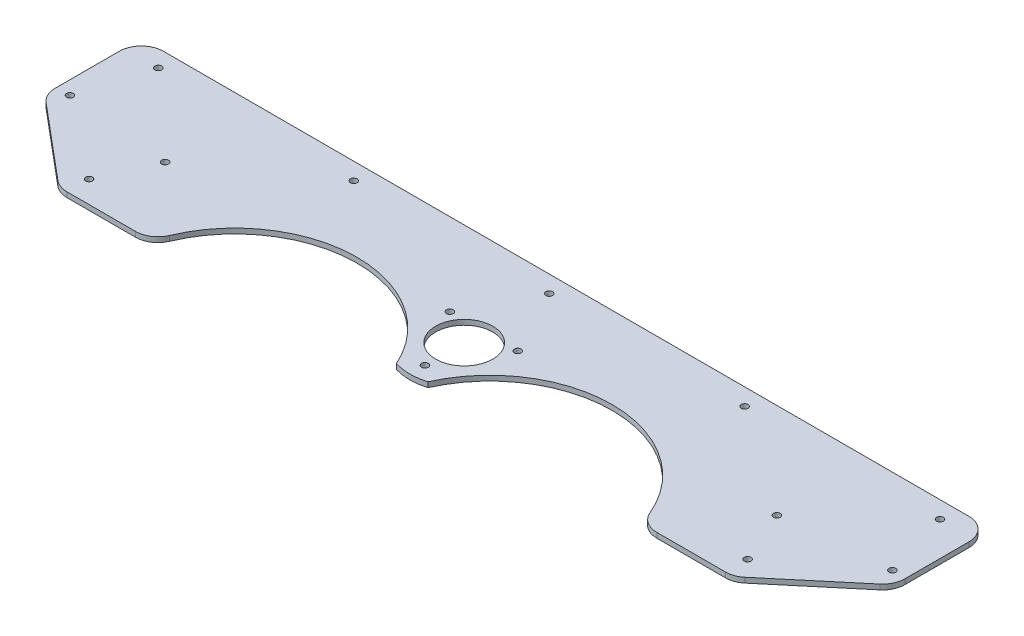
ISO-10303-21;
HEADER;
FILE_DESCRIPTION(('STEP AP214'),'2;1');
FILE_NAME('part.step','',(''),(''),'','','');
FILE_SCHEMA(('AUTOMOTIVE_DESIGN { 1 0 10303 214 1 1 1 1 }'));
ENDSEC;
DATA;
#1=APPLICATION_CONTEXT('core data for automotive mechanical design processes');
#2=APPLICATION_PROTOCOL_DEFINITION('international standard','automotive_design',2000,#1);
#3=PRODUCT_CONTEXT('',#1,'mechanical');
#4=PRODUCT('Part','Part','',(#3));
#5=PRODUCT_RELATED_PRODUCT_CATEGORY('part','',(#4));
#6=PRODUCT_DEFINITION_FORMATION('','',#4);
#7=PRODUCT_DEFINITION_CONTEXT('part definition',#1,'design');
#8=PRODUCT_DEFINITION('design','',#6,#7);
#9=PRODUCT_DEFINITION_SHAPE('','',#8);
#10=(LENGTH_UNIT() NAMED_UNIT(*) SI_UNIT(.MILLI.,.METRE.));
#11=(NAMED_UNIT(*) PLANE_ANGLE_UNIT() SI_UNIT($,.RADIAN.));
#12=(NAMED_UNIT(*) SI_UNIT($,.STERADIAN.) SOLID_ANGLE_UNIT());
#13=UNCERTAINTY_MEASURE_WITH_UNIT(LENGTH_MEASURE(1.E-05),#10,'distance_accuracy_value','');
#14=(GEOMETRIC_REPRESENTATION_CONTEXT(3) GLOBAL_UNCERTAINTY_ASSIGNED_CONTEXT((#13)) GLOBAL_UNIT_ASSIGNED_CONTEXT((#10,
#11,#12)) REPRESENTATION_CONTEXT('',''));
#15=CARTESIAN_POINT('',(0.,0.,0.));
#16=DIRECTION('',(0.,0.,1.));
#17=DIRECTION('',(1.,0.,0.));
#18=AXIS2_PLACEMENT_3D('',#15,#16,#17);
#19=CARTESIAN_POINT('',(0.,1.5,0.));
#20=DIRECTION('',(0.,1.,0.));
#21=DIRECTION('',(0.,0.,1.));
#22=AXIS2_PLACEMENT_3D('',#19,#20,#21);
#23=PLANE('',#22);
#24=CARTESIAN_POINT('',(-121.,1.5,25.));
#25=DIRECTION('',(0.,-1.,0.));
#26=DIRECTION('',(0.,0.,1.));
#27=AXIS2_PLACEMENT_3D('',#24,#25,#26);
#28=CIRCLE('',#27,0.999999999999998);
#29=CARTESIAN_POINT('',(-121.,1.5,26.));
#30=VERTEX_POINT('',#29);
#31=EDGE_CURVE('E379',#30,#30,#28,.T.);
#32=ORIENTED_EDGE('',*,*,#31,.T.);
#33=EDGE_LOOP('',(#32));
#34=FACE_BOUND('',#33,.T.);
#35=CARTESIAN_POINT('',(-90.,1.5,28.));
#36=DIRECTION('',(0.,-1.,0.));
#37=DIRECTION('',(0.,0.,1.));
#38=AXIS2_PLACEMENT_3D('',#35,#36,#37);
#39=CIRCLE('',#38,0.999999999999998);
#40=CARTESIAN_POINT('',(-90.,1.5,29.));
#41=VERTEX_POINT('',#40);
#42=EDGE_CURVE('E386',#41,#41,#39,.T.);
#43=ORIENTED_EDGE('',*,*,#42,.T.);
#44=EDGE_LOOP('',(#43));
#45=FACE_BOUND('',#44,.T.);
#46=CARTESIAN_POINT('',(-96.8841934772697,1.5,43.5));
#47=DIRECTION('',(0.,-1.,0.));
#48=DIRECTION('',(0.,0.,1.));
#49=AXIS2_PLACEMENT_3D('',#46,#47,#48);
#50=CIRCLE('',#49,0.999999999999998);
#51=CARTESIAN_POINT('',(-96.8841934772697,1.5,44.5));
#52=VERTEX_POINT('',#51);
#53=EDGE_CURVE('E392',#52,#52,#50,.T.);
#54=ORIENTED_EDGE('',*,*,#53,.T.);
#55=EDGE_LOOP('',(#54));
#56=FACE_BOUND('',#55,.T.);
#57=CARTESIAN_POINT('',(-115.,1.5,5.));
#58=DIRECTION('',(0.,-1.,0.));
#59=DIRECTION('',(0.,0.,1.));
#60=AXIS2_PLACEMENT_3D('',#57,#58,#59);
#61=CIRCLE('',#60,0.999999999999998);
#62=CARTESIAN_POINT('',(-115.,1.5,6.));
#63=VERTEX_POINT('',#62);
#64=EDGE_CURVE('E398',#63,#63,#61,.T.);
#65=ORIENTED_EDGE('',*,*,#64,.T.);
#66=EDGE_LOOP('',(#65));
#67=FACE_BOUND('',#66,.T.);
#68=CARTESIAN_POINT('',(-57.5,1.5,5.));
#69=DIRECTION('',(0.,-1.,0.));
#70=DIRECTION('',(0.,0.,1.));
#71=AXIS2_PLACEMENT_3D('',#68,#69,#70);
#72=CIRCLE('',#71,0.999999999999998);
#73=CARTESIAN_POINT('',(-57.5,1.5,6.));
#74=VERTEX_POINT('',#73);
#75=EDGE_CURVE('E374',#74,#74,#72,.T.);
#76=ORIENTED_EDGE('',*,*,#75,.T.);
#77=EDGE_LOOP('',(#76));
#78=FACE_BOUND('',#77,.T.);
#79=CARTESIAN_POINT('',(121.,1.5,25.));
#80=DIRECTION('',(0.,1.,0.));
#81=DIRECTION('',(0.,0.,1.));
#82=AXIS2_PLACEMENT_3D('',#79,#80,#81);
#83=CIRCLE('',#82,0.999999999999998);
#84=CARTESIAN_POINT('',(121.,1.5,26.));
#85=VERTEX_POINT('',#84);
#86=EDGE_CURVE('E183',#85,#85,#83,.T.);
#87=ORIENTED_EDGE('',*,*,#86,.F.);
#88=EDGE_LOOP('',(#87));
#89=FACE_BOUND('',#88,.T.);
#90=CARTESIAN_POINT('',(90.,1.5,28.));
#91=DIRECTION('',(0.,1.,0.));
#92=DIRECTION('',(0.,0.,1.));
#93=AXIS2_PLACEMENT_3D('',#90,#91,#92);
#94=CIRCLE('',#93,0.999999999999998);
#95=CARTESIAN_POINT('',(90.,1.5,29.));
#96=VERTEX_POINT('',#95);
#97=EDGE_CURVE('E217',#96,#96,#94,.T.);
#98=ORIENTED_EDGE('',*,*,#97,.F.);
#99=EDGE_LOOP('',(#98));
#100=FACE_BOUND('',#99,.T.);
#101=CARTESIAN_POINT('',(96.8841934772697,1.5,43.5));
#102=DIRECTION('',(0.,1.,0.));
#103=DIRECTION('',(0.,0.,1.));
#104=AXIS2_PLACEMENT_3D('',#101,#102,#103);
#105=CIRCLE('',#104,0.999999999999998);
#106=CARTESIAN_POINT('',(96.8841934772697,1.5,44.5));
#107=VERTEX_POINT('',#106);
#108=EDGE_CURVE('E211',#107,#107,#105,.T.);
#109=ORIENTED_EDGE('',*,*,#108,.F.);
#110=EDGE_LOOP('',(#109));
#111=FACE_BOUND('',#110,.T.);
#112=CARTESIAN_POINT('',(115.,1.5,5.));
#113=DIRECTION('',(0.,1.,0.));
#114=DIRECTION('',(0.,0.,1.));
#115=AXIS2_PLACEMENT_3D('',#112,#113,#114);
#116=CIRCLE('',#115,0.999999999999998);
#117=CARTESIAN_POINT('',(115.,1.5,6.));
#118=VERTEX_POINT('',#117);
#119=EDGE_CURVE('E205',#118,#118,#116,.T.);
#120=ORIENTED_EDGE('',*,*,#119,.F.);
#121=EDGE_LOOP('',(#120));
#122=FACE_BOUND('',#121,.T.);
#123=CARTESIAN_POINT('',(57.5,1.5,5.));
#124=DIRECTION('',(0.,1.,0.));
#125=DIRECTION('',(0.,0.,1.));
#126=AXIS2_PLACEMENT_3D('',#123,#124,#125);
#127=CIRCLE('',#126,0.999999999999998);
#128=CARTESIAN_POINT('',(57.5,1.5,6.));
#129=VERTEX_POINT('',#128);
#130=EDGE_CURVE('E199',#129,#129,#127,.T.);
#131=ORIENTED_EDGE('',*,*,#130,.F.);
#132=EDGE_LOOP('',(#131));
#133=FACE_BOUND('',#132,.T.);
#134=CARTESIAN_POINT('',(0.,1.5,5.));
#135=DIRECTION('',(0.,1.,0.));
#136=DIRECTION('',(0.,0.,1.));
#137=AXIS2_PLACEMENT_3D('',#134,#135,#136);
#138=CIRCLE('',#137,1.);
#139=CARTESIAN_POINT('',(0.,1.5,6.));
#140=VERTEX_POINT('',#139);
#141=EDGE_CURVE('E193',#140,#140,#138,.T.);
#142=ORIENTED_EDGE('',*,*,#141,.F.);
#143=EDGE_LOOP('',(#142));
#144=FACE_BOUND('',#143,.T.);
#145=CARTESIAN_POINT('',(0.,1.5,30.));
#146=DIRECTION('',(0.,1.,0.));
#147=DIRECTION('',(0.,0.,1.));
#148=AXIS2_PLACEMENT_3D('',#145,#146,#147);
#149=CIRCLE('',#148,8.4);
#150=CARTESIAN_POINT('',(0.,1.5,38.4));
#151=VERTEX_POINT('',#150);
#152=EDGE_CURVE('E410',#151,#151,#149,.T.);
#153=ORIENTED_EDGE('',*,*,#152,.F.);
#154=EDGE_LOOP('',(#153));
#155=FACE_BOUND('',#154,.T.);
#156=CARTESIAN_POINT('',(0.,1.5,41.5470053837925));
#157=DIRECTION('',(0.,1.,0.));
#158=DIRECTION('',(0.,0.,1.));
#159=AXIS2_PLACEMENT_3D('',#156,#157,#158);
#160=CIRCLE('',#159,0.999999999999981);
#161=CARTESIAN_POINT('',(0.,1.5,42.5470053837925));
#162=VERTEX_POINT('',#161);
#163=EDGE_CURVE('E427',#162,#162,#160,.T.);
#164=ORIENTED_EDGE('',*,*,#163,.F.);
#165=EDGE_LOOP('',(#164));
#166=FACE_BOUND('',#165,.T.);
#167=CARTESIAN_POINT('',(-10.,1.5,24.2264973081037));
#168=DIRECTION('',(0.,1.,0.));
#169=DIRECTION('',(0.,0.,1.));
#170=AXIS2_PLACEMENT_3D('',#167,#168,#169);
#171=CIRCLE('',#170,1.);
#172=CARTESIAN_POINT('',(-10.,1.5,25.2264973081038));
#173=VERTEX_POINT('',#172);
#174=EDGE_CURVE('E421',#173,#173,#171,.T.);
#175=ORIENTED_EDGE('',*,*,#174,.F.);
#176=EDGE_LOOP('',(#175));
#177=FACE_BOUND('',#176,.T.);
#178=CARTESIAN_POINT('',(10.,1.5,24.2264973081037));
#179=DIRECTION('',(0.,1.,0.));
#180=DIRECTION('',(0.,0.,1.));
#181=AXIS2_PLACEMENT_3D('',#178,#179,#180);
#182=CIRCLE('',#181,1.);
#183=CARTESIAN_POINT('',(10.,1.5,25.2264973081038));
#184=VERTEX_POINT('',#183);
#185=EDGE_CURVE('E167',#184,#184,#182,.T.);
#186=ORIENTED_EDGE('',*,*,#185,.F.);
#187=EDGE_LOOP('',(#186));
#188=FACE_BOUND('',#187,.T.);
#189=CARTESIAN_POINT('',(0.,1.5,30.));
#190=DIRECTION('',(0.,-1.,0.));
#191=DIRECTION('',(0.,0.,1.));
#192=AXIS2_PLACEMENT_3D('',#189,#190,#191);
#193=CIRCLE('',#192,16.);
#194=CARTESIAN_POINT('',(4.63128073876891,1.5,45.3150657432056));
#195=VERTEX_POINT('',#194);
#196=CARTESIAN_POINT('',(-4.6312807387689,1.5,45.3150657432056));
#197=VERTEX_POINT('',#196);
#198=EDGE_CURVE('E50',#195,#197,#193,.T.);
#199=ORIENTED_EDGE('',*,*,#198,.F.);
#200=CARTESIAN_POINT('',(37.5,1.5,60.));
#201=DIRECTION('',(0.,1.,0.));
#202=DIRECTION('',(0.,0.,1.));
#203=AXIS2_PLACEMENT_3D('',#200,#201,#202);
#204=CIRCLE('',#203,36.);
#205=CARTESIAN_POINT('',(70.6761702114062,1.5,46.0235294117647));
#206=VERTEX_POINT('',#205);
#207=EDGE_CURVE('E171',#206,#195,#204,.T.);
#208=ORIENTED_EDGE('',*,*,#207,.F.);
#209=CARTESIAN_POINT('',(76.6663120551323,1.5,43.5));
#210=DIRECTION('',(0.,1.,0.));
#211=DIRECTION('',(0.,0.,1.));
#212=AXIS2_PLACEMENT_3D('',#209,#210,#211);
#213=CIRCLE('',#212,6.5);
#214=CARTESIAN_POINT('',(76.6663120551323,1.5,50.));
#215=VERTEX_POINT('',#214);
#216=EDGE_CURVE('E265',#206,#215,#213,.T.);
#217=ORIENTED_EDGE('',*,*,#216,.T.);
#218=DIRECTION('',(1.,0.,0.));
#219=VECTOR('',#218,1.);
#220=CARTESIAN_POINT('',(0.,1.5,50.));
#221=LINE('',#220,#219);
#222=CARTESIAN_POINT('',(96.8841934772697,1.5,50.));
#223=VERTEX_POINT('',#222);
#224=EDGE_CURVE('E232',#215,#223,#221,.T.);
#225=ORIENTED_EDGE('',*,*,#224,.T.);
#226=CARTESIAN_POINT('',(96.8841934772697,1.5,43.5));
#227=DIRECTION('',(0.,1.,0.));
#228=DIRECTION('',(0.,0.,1.));
#229=AXIS2_PLACEMENT_3D('',#226,#227,#228);
#230=CIRCLE('',#229,6.5);
#231=CARTESIAN_POINT('',(101.062312940232,1.5,48.4792888802734));
#232=VERTEX_POINT('',#231);
#233=EDGE_CURVE('E57',#223,#232,#230,.T.);
#234=ORIENTED_EDGE('',*,*,#233,.T.);
#235=DIRECTION('',(-0.766044443118979,0.,0.642787609686538));
#236=VECTOR('',#235,1.);
#237=CARTESIAN_POINT('',(65.6279030085836,1.5,78.2122891849042));
#238=LINE('',#237,#236);
#239=CARTESIAN_POINT('',(122.678119462962,1.5,30.341473599451));
#240=VERTEX_POINT('',#239);
#241=EDGE_CURVE('E234',#240,#232,#238,.T.);
#242=ORIENTED_EDGE('',*,*,#241,.F.);
#243=CARTESIAN_POINT('',(118.5,1.5,25.3621847191776));
#244=DIRECTION('',(0.,1.,0.));
#245=DIRECTION('',(0.,0.,1.));
#246=AXIS2_PLACEMENT_3D('',#243,#244,#245);
#247=CIRCLE('',#246,6.5);
#248=CARTESIAN_POINT('',(125.,1.5,25.3621847191776));
#249=VERTEX_POINT('',#248);
#250=EDGE_CURVE('E262',#240,#249,#247,.T.);
#251=ORIENTED_EDGE('',*,*,#250,.T.);
#252=DIRECTION('',(0.,0.,1.));
#253=VECTOR('',#252,1.);
#254=CARTESIAN_POINT('',(125.,1.5,0.));
#255=LINE('',#254,#253);
#256=CARTESIAN_POINT('',(125.,1.5,6.5));
#257=VERTEX_POINT('',#256);
#258=EDGE_CURVE('E225',#257,#249,#255,.T.);
#259=ORIENTED_EDGE('',*,*,#258,.F.);
#260=CARTESIAN_POINT('',(118.5,1.5,6.5));
#261=DIRECTION('',(0.,1.,0.));
#262=DIRECTION('',(0.,0.,1.));
#263=AXIS2_PLACEMENT_3D('',#260,#261,#262);
#264=CIRCLE('',#263,6.5);
#265=CARTESIAN_POINT('',(118.5,1.5,0.));
#266=VERTEX_POINT('',#265);
#267=EDGE_CURVE('E267',#257,#266,#264,.T.);
#268=ORIENTED_EDGE('',*,*,#267,.T.);
#269=DIRECTION('',(1.,0.,0.));
#270=VECTOR('',#269,1.);
#271=CARTESIAN_POINT('',(0.,1.5,0.));
#272=LINE('',#271,#270);
#273=CARTESIAN_POINT('',(-118.5,1.5,0.));
#274=VERTEX_POINT('',#273);
#275=EDGE_CURVE('E228',#274,#266,#272,.T.);
#276=ORIENTED_EDGE('',*,*,#275,.F.);
#277=CARTESIAN_POINT('',(-118.5,1.5,6.5));
#278=DIRECTION('',(0.,-1.,0.));
#279=DIRECTION('',(0.,0.,1.));
#280=AXIS2_PLACEMENT_3D('',#277,#278,#279);
#281=CIRCLE('',#280,6.5);
#282=CARTESIAN_POINT('',(-125.,1.5,6.5));
#283=VERTEX_POINT('',#282);
#284=EDGE_CURVE('E316',#283,#274,#281,.T.);
#285=ORIENTED_EDGE('',*,*,#284,.F.);
#286=DIRECTION('',(0.,0.,1.));
#287=VECTOR('',#286,1.);
#288=CARTESIAN_POINT('',(-125.,1.5,0.));
#289=LINE('',#288,#287);
#290=CARTESIAN_POINT('',(-125.,1.5,25.3621847191776));
#291=VERTEX_POINT('',#290);
#292=EDGE_CURVE('E364',#283,#291,#289,.T.);
#293=ORIENTED_EDGE('',*,*,#292,.T.);
#294=CARTESIAN_POINT('',(-118.5,1.5,25.3621847191776));
#295=DIRECTION('',(0.,-1.,0.));
#296=DIRECTION('',(0.,0.,1.));
#297=AXIS2_PLACEMENT_3D('',#294,#295,#296);
#298=CIRCLE('',#297,6.5);
#299=CARTESIAN_POINT('',(-122.678119462962,1.5,30.341473599451));
#300=VERTEX_POINT('',#299);
#301=EDGE_CURVE('E336',#300,#291,#298,.T.);
#302=ORIENTED_EDGE('',*,*,#301,.F.);
#303=DIRECTION('',(0.766044443118979,0.,0.642787609686538));
#304=VECTOR('',#303,1.);
#305=CARTESIAN_POINT('',(-65.6279030085836,1.5,78.2122891849042));
#306=LINE('',#305,#304);
#307=CARTESIAN_POINT('',(-101.062312940232,1.5,48.4792888802734));
#308=VERTEX_POINT('',#307);
#309=EDGE_CURVE('E318',#300,#308,#306,.T.);
#310=ORIENTED_EDGE('',*,*,#309,.T.);
#311=CARTESIAN_POINT('',(-96.8841934772697,1.5,43.5));
#312=DIRECTION('',(0.,-1.,0.));
#313=DIRECTION('',(0.,0.,1.));
#314=AXIS2_PLACEMENT_3D('',#311,#312,#313);
#315=CIRCLE('',#314,6.5);
#316=CARTESIAN_POINT('',(-96.8841934772697,1.5,50.));
#317=VERTEX_POINT('',#316);
#318=EDGE_CURVE('E338',#317,#308,#315,.T.);
#319=ORIENTED_EDGE('',*,*,#318,.F.);
#320=DIRECTION('',(-1.,0.,0.));
#321=VECTOR('',#320,1.);
#322=CARTESIAN_POINT('',(0.,1.5,50.));
#323=LINE('',#322,#321);
#324=CARTESIAN_POINT('',(-76.6663120551323,1.5,50.));
#325=VERTEX_POINT('',#324);
#326=EDGE_CURVE('E323',#325,#317,#323,.T.);
#327=ORIENTED_EDGE('',*,*,#326,.F.);
#328=CARTESIAN_POINT('',(-76.6663120551323,1.5,43.5));
#329=DIRECTION('',(0.,-1.,0.));
#330=DIRECTION('',(0.,0.,1.));
#331=AXIS2_PLACEMENT_3D('',#328,#329,#330);
#332=CIRCLE('',#331,6.5);
#333=CARTESIAN_POINT('',(-70.6761702114062,1.5,46.0235294117647));
#334=VERTEX_POINT('',#333);
#335=EDGE_CURVE('E340',#334,#325,#332,.T.);
#336=ORIENTED_EDGE('',*,*,#335,.F.);
#337=CARTESIAN_POINT('',(-37.5,1.5,60.));
#338=DIRECTION('',(0.,-1.,0.));
#339=DIRECTION('',(0.,0.,1.));
#340=AXIS2_PLACEMENT_3D('',#337,#338,#339);
#341=CIRCLE('',#340,36.);
#342=EDGE_CURVE('E175',#334,#197,#341,.T.);
#343=ORIENTED_EDGE('',*,*,#342,.T.);
#344=EDGE_LOOP('',(#199,#208,#217,#225,#234,#242,#251,#259,#268,#276,#285,#293,#302,#310,#319,
#327,#336,#343));
#345=FACE_BOUND('',#344,.T.);
#346=ADVANCED_FACE('F35',(#34,#45,#56,#67,#78,#89,#100,#111,#122,#133,#144,#155,#166,#177,#188,
#345),#23,.T.);
#347=CARTESIAN_POINT('',(0.,0.,0.));
#348=DIRECTION('',(0.,1.,0.));
#349=DIRECTION('',(0.,0.,1.));
#350=AXIS2_PLACEMENT_3D('',#347,#348,#349);
#351=PLANE('',#350);
#352=CARTESIAN_POINT('',(10.,0.,24.2264973081037));
#353=DIRECTION('',(0.,1.,0.));
#354=DIRECTION('',(0.,0.,1.));
#355=AXIS2_PLACEMENT_3D('',#352,#353,#354);
#356=CIRCLE('',#355,1.);
#357=CARTESIAN_POINT('',(10.,0.,25.2264973081038));
#358=VERTEX_POINT('',#357);
#359=EDGE_CURVE('E418',#358,#358,#356,.T.);
#360=ORIENTED_EDGE('',*,*,#359,.T.);
#361=EDGE_LOOP('',(#360));
#362=FACE_BOUND('',#361,.T.);
#363=CARTESIAN_POINT('',(-10.,0.,24.2264973081037));
#364=DIRECTION('',(0.,1.,0.));
#365=DIRECTION('',(0.,0.,1.));
#366=AXIS2_PLACEMENT_3D('',#363,#364,#365);
#367=CIRCLE('',#366,1.);
#368=CARTESIAN_POINT('',(-10.,0.,25.2264973081038));
#369=VERTEX_POINT('',#368);
#370=EDGE_CURVE('E424',#369,#369,#367,.T.);
#371=ORIENTED_EDGE('',*,*,#370,.T.);
#372=EDGE_LOOP('',(#371));
#373=FACE_BOUND('',#372,.T.);
#374=CARTESIAN_POINT('',(0.,0.,41.5470053837925));
#375=DIRECTION('',(0.,1.,0.));
#376=DIRECTION('',(0.,0.,1.));
#377=AXIS2_PLACEMENT_3D('',#374,#375,#376);
#378=CIRCLE('',#377,0.999999999999981);
#379=CARTESIAN_POINT('',(0.,0.,42.5470053837925));
#380=VERTEX_POINT('',#379);
#381=EDGE_CURVE('E413',#380,#380,#378,.T.);
#382=ORIENTED_EDGE('',*,*,#381,.T.);
#383=EDGE_LOOP('',(#382));
#384=FACE_BOUND('',#383,.T.);
#385=CARTESIAN_POINT('',(0.,0.,30.));
#386=DIRECTION('',(0.,1.,0.));
#387=DIRECTION('',(0.,0.,1.));
#388=AXIS2_PLACEMENT_3D('',#385,#386,#387);
#389=CIRCLE('',#388,8.4);
#390=CARTESIAN_POINT('',(0.,0.,38.4));
#391=VERTEX_POINT('',#390);
#392=EDGE_CURVE('E407',#391,#391,#389,.T.);
#393=ORIENTED_EDGE('',*,*,#392,.T.);
#394=EDGE_LOOP('',(#393));
#395=FACE_BOUND('',#394,.T.);
#396=CARTESIAN_POINT('',(0.,0.,5.));
#397=DIRECTION('',(0.,1.,0.));
#398=DIRECTION('',(0.,0.,1.));
#399=AXIS2_PLACEMENT_3D('',#396,#397,#398);
#400=CIRCLE('',#399,1.);
#401=CARTESIAN_POINT('',(0.,0.,6.));
#402=VERTEX_POINT('',#401);
#403=EDGE_CURVE('E189',#402,#402,#400,.T.);
#404=ORIENTED_EDGE('',*,*,#403,.T.);
#405=EDGE_LOOP('',(#404));
#406=FACE_BOUND('',#405,.T.);
#407=CARTESIAN_POINT('',(57.5,0.,5.));
#408=DIRECTION('',(0.,1.,0.));
#409=DIRECTION('',(0.,0.,1.));
#410=AXIS2_PLACEMENT_3D('',#407,#408,#409);
#411=CIRCLE('',#410,0.999999999999998);
#412=CARTESIAN_POINT('',(57.5,0.,6.));
#413=VERTEX_POINT('',#412);
#414=EDGE_CURVE('E196',#413,#413,#411,.T.);
#415=ORIENTED_EDGE('',*,*,#414,.T.);
#416=EDGE_LOOP('',(#415));
#417=FACE_BOUND('',#416,.T.);
#418=CARTESIAN_POINT('',(115.,0.,5.));
#419=DIRECTION('',(0.,1.,0.));
#420=DIRECTION('',(0.,0.,1.));
#421=AXIS2_PLACEMENT_3D('',#418,#419,#420);
#422=CIRCLE('',#421,0.999999999999998);
#423=CARTESIAN_POINT('',(115.,0.,6.));
#424=VERTEX_POINT('',#423);
#425=EDGE_CURVE('E202',#424,#424,#422,.T.);
#426=ORIENTED_EDGE('',*,*,#425,.T.);
#427=EDGE_LOOP('',(#426));
#428=FACE_BOUND('',#427,.T.);
#429=CARTESIAN_POINT('',(96.8841934772697,0.,43.5));
#430=DIRECTION('',(0.,1.,0.));
#431=DIRECTION('',(0.,0.,1.));
#432=AXIS2_PLACEMENT_3D('',#429,#430,#431);
#433=CIRCLE('',#432,0.999999999999998);
#434=CARTESIAN_POINT('',(96.8841934772697,0.,44.5));
#435=VERTEX_POINT('',#434);
#436=EDGE_CURVE('E208',#435,#435,#433,.T.);
#437=ORIENTED_EDGE('',*,*,#436,.T.);
#438=EDGE_LOOP('',(#437));
#439=FACE_BOUND('',#438,.T.);
#440=CARTESIAN_POINT('',(90.,0.,28.));
#441=DIRECTION('',(0.,1.,0.));
#442=DIRECTION('',(0.,0.,1.));
#443=AXIS2_PLACEMENT_3D('',#440,#441,#442);
#444=CIRCLE('',#443,0.999999999999998);
#445=CARTESIAN_POINT('',(90.,0.,29.));
#446=VERTEX_POINT('',#445);
#447=EDGE_CURVE('E214',#446,#446,#444,.T.);
#448=ORIENTED_EDGE('',*,*,#447,.T.);
#449=EDGE_LOOP('',(#448));
#450=FACE_BOUND('',#449,.T.);
#451=CARTESIAN_POINT('',(121.,0.,25.));
#452=DIRECTION('',(0.,1.,0.));
#453=DIRECTION('',(0.,0.,1.));
#454=AXIS2_PLACEMENT_3D('',#451,#452,#453);
#455=CIRCLE('',#454,0.999999999999998);
#456=CARTESIAN_POINT('',(121.,0.,26.));
#457=VERTEX_POINT('',#456);
#458=EDGE_CURVE('E220',#457,#457,#455,.T.);
#459=ORIENTED_EDGE('',*,*,#458,.T.);
#460=EDGE_LOOP('',(#459));
#461=FACE_BOUND('',#460,.T.);
#462=CARTESIAN_POINT('',(-57.5,0.,5.));
#463=DIRECTION('',(0.,-1.,0.));
#464=DIRECTION('',(0.,0.,1.));
#465=AXIS2_PLACEMENT_3D('',#462,#463,#464);
#466=CIRCLE('',#465,0.999999999999998);
#467=CARTESIAN_POINT('',(-57.5,0.,6.));
#468=VERTEX_POINT('',#467);
#469=EDGE_CURVE('E370',#468,#468,#466,.T.);
#470=ORIENTED_EDGE('',*,*,#469,.F.);
#471=EDGE_LOOP('',(#470));
#472=FACE_BOUND('',#471,.T.);
#473=CARTESIAN_POINT('',(-115.,0.,5.));
#474=DIRECTION('',(0.,-1.,0.));
#475=DIRECTION('',(0.,0.,1.));
#476=AXIS2_PLACEMENT_3D('',#473,#474,#475);
#477=CIRCLE('',#476,0.999999999999998);
#478=CARTESIAN_POINT('',(-115.,0.,6.));
#479=VERTEX_POINT('',#478);
#480=EDGE_CURVE('E401',#479,#479,#477,.T.);
#481=ORIENTED_EDGE('',*,*,#480,.F.);
#482=EDGE_LOOP('',(#481));
#483=FACE_BOUND('',#482,.T.);
#484=CARTESIAN_POINT('',(-96.8841934772697,0.,43.5));
#485=DIRECTION('',(0.,-1.,0.));
#486=DIRECTION('',(0.,0.,1.));
#487=AXIS2_PLACEMENT_3D('',#484,#485,#486);
#488=CIRCLE('',#487,0.999999999999998);
#489=CARTESIAN_POINT('',(-96.8841934772697,0.,44.5));
#490=VERTEX_POINT('',#489);
#491=EDGE_CURVE('E395',#490,#490,#488,.T.);
#492=ORIENTED_EDGE('',*,*,#491,.F.);
#493=EDGE_LOOP('',(#492));
#494=FACE_BOUND('',#493,.T.);
#495=CARTESIAN_POINT('',(-90.,0.,28.));
#496=DIRECTION('',(0.,-1.,0.));
#497=DIRECTION('',(0.,0.,1.));
#498=AXIS2_PLACEMENT_3D('',#495,#496,#497);
#499=CIRCLE('',#498,0.999999999999998);
#500=CARTESIAN_POINT('',(-90.,0.,29.));
#501=VERTEX_POINT('',#500);
#502=EDGE_CURVE('E389',#501,#501,#499,.T.);
#503=ORIENTED_EDGE('',*,*,#502,.F.);
#504=EDGE_LOOP('',(#503));
#505=FACE_BOUND('',#504,.T.);
#506=CARTESIAN_POINT('',(-121.,0.,25.));
#507=DIRECTION('',(0.,-1.,0.));
#508=DIRECTION('',(0.,0.,1.));
#509=AXIS2_PLACEMENT_3D('',#506,#507,#508);
#510=CIRCLE('',#509,0.999999999999998);
#511=CARTESIAN_POINT('',(-121.,0.,26.));
#512=VERTEX_POINT('',#511);
#513=EDGE_CURVE('E382',#512,#512,#510,.T.);
#514=ORIENTED_EDGE('',*,*,#513,.F.);
#515=EDGE_LOOP('',(#514));
#516=FACE_BOUND('',#515,.T.);
#517=CARTESIAN_POINT('',(37.5,0.,60.));
#518=DIRECTION('',(0.,1.,0.));
#519=DIRECTION('',(0.,0.,1.));
#520=AXIS2_PLACEMENT_3D('',#517,#518,#519);
#521=CIRCLE('',#520,36.);
#522=CARTESIAN_POINT('',(70.6761702114062,0.,46.0235294117647));
#523=VERTEX_POINT('',#522);
#524=CARTESIAN_POINT('',(4.63128073876891,0.,45.3150657432056));
#525=VERTEX_POINT('',#524);
#526=EDGE_CURVE('E180',#523,#525,#521,.T.);
#527=ORIENTED_EDGE('',*,*,#526,.T.);
#528=CARTESIAN_POINT('',(0.,0.,30.));
#529=DIRECTION('',(0.,-1.,0.));
#530=DIRECTION('',(0.,0.,1.));
#531=AXIS2_PLACEMENT_3D('',#528,#529,#530);
#532=CIRCLE('',#531,16.);
#533=CARTESIAN_POINT('',(-4.63128073876891,0.,45.3150657432056));
#534=VERTEX_POINT('',#533);
#535=EDGE_CURVE('E162',#525,#534,#532,.T.);
#536=ORIENTED_EDGE('',*,*,#535,.T.);
#537=CARTESIAN_POINT('',(-37.5,0.,60.));
#538=DIRECTION('',(0.,-1.,0.));
#539=DIRECTION('',(0.,0.,1.));
#540=AXIS2_PLACEMENT_3D('',#537,#538,#539);
#541=CIRCLE('',#540,36.);
#542=CARTESIAN_POINT('',(-70.6761702114062,0.,46.0235294117647));
#543=VERTEX_POINT('',#542);
#544=EDGE_CURVE('E383',#543,#534,#541,.T.);
#545=ORIENTED_EDGE('',*,*,#544,.F.);
#546=CARTESIAN_POINT('',(-76.6663120551323,0.,43.5));
#547=DIRECTION('',(0.,-1.,0.));
#548=DIRECTION('',(0.,0.,1.));
#549=AXIS2_PLACEMENT_3D('',#546,#547,#548);
#550=CIRCLE('',#549,6.5);
#551=CARTESIAN_POINT('',(-76.6663120551323,0.,50.));
#552=VERTEX_POINT('',#551);
#553=EDGE_CURVE('E311',#552,#543,#550,.F.);
#554=ORIENTED_EDGE('',*,*,#553,.F.);
#555=DIRECTION('',(-1.,0.,0.));
#556=VECTOR('',#555,1.);
#557=CARTESIAN_POINT('',(0.,0.,50.));
#558=LINE('',#557,#556);
#559=CARTESIAN_POINT('',(-96.8841934772697,0.,50.));
#560=VERTEX_POINT('',#559);
#561=EDGE_CURVE('E369',#552,#560,#558,.T.);
#562=ORIENTED_EDGE('',*,*,#561,.T.);
#563=CARTESIAN_POINT('',(-96.8841934772697,0.,43.5));
#564=DIRECTION('',(0.,-1.,0.));
#565=DIRECTION('',(0.,0.,1.));
#566=AXIS2_PLACEMENT_3D('',#563,#564,#565);
#567=CIRCLE('',#566,6.5);
#568=CARTESIAN_POINT('',(-101.062312940232,0.,48.4792888802734));
#569=VERTEX_POINT('',#568);
#570=EDGE_CURVE('E320',#569,#560,#567,.F.);
#571=ORIENTED_EDGE('',*,*,#570,.F.);
#572=DIRECTION('',(0.766044443118979,0.,0.642787609686538));
#573=VECTOR('',#572,1.);
#574=CARTESIAN_POINT('',(-65.6279030085836,0.,78.2122891849042));
#575=LINE('',#574,#573);
#576=CARTESIAN_POINT('',(-122.678119462962,0.,30.341473599451));
#577=VERTEX_POINT('',#576);
#578=EDGE_CURVE('E326',#577,#569,#575,.T.);
#579=ORIENTED_EDGE('',*,*,#578,.F.);
#580=CARTESIAN_POINT('',(-118.5,0.,25.3621847191776));
#581=DIRECTION('',(0.,-1.,0.));
#582=DIRECTION('',(0.,0.,1.));
#583=AXIS2_PLACEMENT_3D('',#580,#581,#582);
#584=CIRCLE('',#583,6.5);
#585=CARTESIAN_POINT('',(-125.,0.,25.3621847191776));
#586=VERTEX_POINT('',#585);
#587=EDGE_CURVE('E317',#586,#577,#584,.F.);
#588=ORIENTED_EDGE('',*,*,#587,.F.);
#589=DIRECTION('',(0.,0.,1.));
#590=VECTOR('',#589,1.);
#591=CARTESIAN_POINT('',(-125.,0.,0.));
#592=LINE('',#591,#590);
#593=CARTESIAN_POINT('',(-125.,0.,6.5));
#594=VERTEX_POINT('',#593);
#595=EDGE_CURVE('E306',#594,#586,#592,.T.);
#596=ORIENTED_EDGE('',*,*,#595,.F.);
#597=CARTESIAN_POINT('',(-118.5,0.,6.5));
#598=DIRECTION('',(0.,-1.,0.));
#599=DIRECTION('',(0.,0.,1.));
#600=AXIS2_PLACEMENT_3D('',#597,#598,#599);
#601=CIRCLE('',#600,6.5);
#602=CARTESIAN_POINT('',(-118.5,0.,0.));
#603=VERTEX_POINT('',#602);
#604=EDGE_CURVE('E303',#603,#594,#601,.F.);
#605=ORIENTED_EDGE('',*,*,#604,.F.);
#606=DIRECTION('',(1.,0.,0.));
#607=VECTOR('',#606,1.);
#608=CARTESIAN_POINT('',(0.,0.,0.));
#609=LINE('',#608,#607);
#610=CARTESIAN_POINT('',(118.5,0.,0.));
#611=VERTEX_POINT('',#610);
#612=EDGE_CURVE('E239',#603,#611,#609,.T.);
#613=ORIENTED_EDGE('',*,*,#612,.T.);
#614=CARTESIAN_POINT('',(118.5,0.,6.5));
#615=DIRECTION('',(0.,1.,0.));
#616=DIRECTION('',(0.,0.,1.));
#617=AXIS2_PLACEMENT_3D('',#614,#615,#616);
#618=CIRCLE('',#617,6.5);
#619=CARTESIAN_POINT('',(125.,0.,6.5));
#620=VERTEX_POINT('',#619);
#621=EDGE_CURVE('E255',#611,#620,#618,.F.);
#622=ORIENTED_EDGE('',*,*,#621,.T.);
#623=DIRECTION('',(0.,0.,1.));
#624=VECTOR('',#623,1.);
#625=CARTESIAN_POINT('',(125.,0.,0.));
#626=LINE('',#625,#624);
#627=CARTESIAN_POINT('',(125.,0.,25.3621847191776));
#628=VERTEX_POINT('',#627);
#629=EDGE_CURVE('E192',#620,#628,#626,.T.);
#630=ORIENTED_EDGE('',*,*,#629,.T.);
#631=CARTESIAN_POINT('',(118.5,0.,25.3621847191776));
#632=DIRECTION('',(0.,1.,0.));
#633=DIRECTION('',(0.,0.,1.));
#634=AXIS2_PLACEMENT_3D('',#631,#632,#633);
#635=CIRCLE('',#634,6.5);
#636=CARTESIAN_POINT('',(122.678119462962,0.,30.341473599451));
#637=VERTEX_POINT('',#636);
#638=EDGE_CURVE('E249',#628,#637,#635,.F.);
#639=ORIENTED_EDGE('',*,*,#638,.T.);
#640=DIRECTION('',(-0.766044443118979,0.,0.642787609686538));
#641=VECTOR('',#640,1.);
#642=CARTESIAN_POINT('',(65.6279030085836,0.,78.2122891849042));
#643=LINE('',#642,#641);
#644=CARTESIAN_POINT('',(101.062312940232,0.,48.4792888802734));
#645=VERTEX_POINT('',#644);
#646=EDGE_CURVE('E229',#637,#645,#643,.T.);
#647=ORIENTED_EDGE('',*,*,#646,.T.);
#648=CARTESIAN_POINT('',(96.8841934772697,0.,43.5));
#649=DIRECTION('',(0.,1.,0.));
#650=DIRECTION('',(0.,0.,1.));
#651=AXIS2_PLACEMENT_3D('',#648,#649,#650);
#652=CIRCLE('',#651,6.5);
#653=CARTESIAN_POINT('',(96.8841934772697,0.,50.));
#654=VERTEX_POINT('',#653);
#655=EDGE_CURVE('E251',#645,#654,#652,.F.);
#656=ORIENTED_EDGE('',*,*,#655,.T.);
#657=DIRECTION('',(1.,0.,0.));
#658=VECTOR('',#657,1.);
#659=CARTESIAN_POINT('',(0.,0.,50.));
#660=LINE('',#659,#658);
#661=CARTESIAN_POINT('',(76.6663120551323,0.,50.));
#662=VERTEX_POINT('',#661);
#663=EDGE_CURVE('E242',#662,#654,#660,.T.);
#664=ORIENTED_EDGE('',*,*,#663,.F.);
#665=CARTESIAN_POINT('',(76.6663120551323,0.,43.5));
#666=DIRECTION('',(0.,1.,0.));
#667=DIRECTION('',(0.,0.,1.));
#668=AXIS2_PLACEMENT_3D('',#665,#666,#667);
#669=CIRCLE('',#668,6.5);
#670=EDGE_CURVE('E253',#662,#523,#669,.F.);
#671=ORIENTED_EDGE('',*,*,#670,.T.);
#672=EDGE_LOOP('',(#527,#536,#545,#554,#562,#571,#579,#588,#596,#605,#613,#622,#630,#639,#647,
#656,#664,#671));
#673=FACE_BOUND('',#672,.T.);
#674=ADVANCED_FACE('F284',(#362,#373,#384,#395,#406,#417,#428,#439,#450,#461,#472,#483,#494,
#505,#516,#673),#351,.F.);
#675=CARTESIAN_POINT('',(125.,1.5,0.));
#676=DIRECTION('',(1.,0.,0.));
#677=DIRECTION('',(0.,0.,-1.));
#678=AXIS2_PLACEMENT_3D('',#675,#676,#677);
#679=PLANE('',#678);
#680=ORIENTED_EDGE('',*,*,#629,.F.);
#681=DIRECTION('',(0.,-1.,0.));
#682=VECTOR('',#681,1.);
#683=CARTESIAN_POINT('',(125.,1.5,6.5));
#684=LINE('',#683,#682);
#685=EDGE_CURVE('E260',#620,#257,#684,.F.);
#686=ORIENTED_EDGE('',*,*,#685,.T.);
#687=ORIENTED_EDGE('',*,*,#258,.T.);
#688=DIRECTION('',(0.,-1.,0.));
#689=VECTOR('',#688,1.);
#690=CARTESIAN_POINT('',(125.,1.5,25.3621847191776));
#691=LINE('',#690,#689);
#692=EDGE_CURVE('E257',#249,#628,#691,.T.);
#693=ORIENTED_EDGE('',*,*,#692,.T.);
#694=EDGE_LOOP('',(#680,#686,#687,#693));
#695=FACE_BOUND('',#694,.T.);
#696=ADVANCED_FACE('F291',(#695),#679,.T.);
#697=CARTESIAN_POINT('',(0.,1.5,0.));
#698=DIRECTION('',(0.,0.,-1.));
#699=DIRECTION('',(-1.,0.,0.));
#700=AXIS2_PLACEMENT_3D('',#697,#698,#699);
#701=PLANE('',#700);
#702=ORIENTED_EDGE('',*,*,#275,.T.);
#703=DIRECTION('',(0.,-1.,0.));
#704=VECTOR('',#703,1.);
#705=CARTESIAN_POINT('',(118.5,1.5,0.));
#706=LINE('',#705,#704);
#707=EDGE_CURVE('E236',#266,#611,#706,.T.);
#708=ORIENTED_EDGE('',*,*,#707,.T.);
#709=ORIENTED_EDGE('',*,*,#612,.F.);
#710=DIRECTION('',(0.,-1.,0.));
#711=VECTOR('',#710,1.);
#712=CARTESIAN_POINT('',(-118.5,1.5,0.));
#713=LINE('',#712,#711);
#714=EDGE_CURVE('E314',#274,#603,#713,.T.);
#715=ORIENTED_EDGE('',*,*,#714,.F.);
#716=EDGE_LOOP('',(#702,#708,#709,#715));
#717=FACE_BOUND('',#716,.T.);
#718=ADVANCED_FACE('F299',(#717),#701,.T.);
#719=CARTESIAN_POINT('',(0.,1.5,50.));
#720=DIRECTION('',(0.,0.,-1.));
#721=DIRECTION('',(-1.,0.,0.));
#722=AXIS2_PLACEMENT_3D('',#719,#720,#721);
#723=PLANE('',#722);
#724=ORIENTED_EDGE('',*,*,#224,.F.);
#725=DIRECTION('',(0.,1.,0.));
#726=VECTOR('',#725,1.);
#727=CARTESIAN_POINT('',(76.6663120551323,1.5,50.));
#728=LINE('',#727,#726);
#729=EDGE_CURVE('E271',#215,#662,#728,.F.);
#730=ORIENTED_EDGE('',*,*,#729,.T.);
#731=ORIENTED_EDGE('',*,*,#663,.T.);
#732=DIRECTION('',(0.,-1.,0.));
#733=VECTOR('',#732,1.);
#734=CARTESIAN_POINT('',(96.8841934772697,1.5,50.));
#735=LINE('',#734,#733);
#736=EDGE_CURVE('E269',#654,#223,#735,.F.);
#737=ORIENTED_EDGE('',*,*,#736,.T.);
#738=EDGE_LOOP('',(#724,#730,#731,#737));
#739=FACE_BOUND('',#738,.T.);
#740=ADVANCED_FACE('F468',(#739),#723,.F.);
#741=CARTESIAN_POINT('',(65.6279030085836,1.5,78.2122891849042));
#742=DIRECTION('',(0.642787609686538,0.,0.766044443118979));
#743=DIRECTION('',(0.766044443118979,0.,-0.642787609686538));
#744=AXIS2_PLACEMENT_3D('',#741,#742,#743);
#745=PLANE('',#744);
#746=ORIENTED_EDGE('',*,*,#241,.T.);
#747=DIRECTION('',(0.,-1.,0.));
#748=VECTOR('',#747,1.);
#749=CARTESIAN_POINT('',(101.062312940232,0.,48.4792888802734));
#750=LINE('',#749,#748);
#751=EDGE_CURVE('E43',#232,#645,#750,.T.);
#752=ORIENTED_EDGE('',*,*,#751,.T.);
#753=ORIENTED_EDGE('',*,*,#646,.F.);
#754=DIRECTION('',(0.,-1.,0.));
#755=VECTOR('',#754,1.);
#756=CARTESIAN_POINT('',(122.678119462962,1.5,30.341473599451));
#757=LINE('',#756,#755);
#758=EDGE_CURVE('E275',#637,#240,#757,.F.);
#759=ORIENTED_EDGE('',*,*,#758,.T.);
#760=EDGE_LOOP('',(#746,#752,#753,#759));
#761=FACE_BOUND('',#760,.T.);
#762=ADVANCED_FACE('F280',(#761),#745,.T.);
#763=CARTESIAN_POINT('',(121.,0.,25.));
#764=DIRECTION('',(0.,1.,0.));
#765=DIRECTION('',(0.,0.,1.));
#766=AXIS2_PLACEMENT_3D('',#763,#764,#765);
#767=CYLINDRICAL_SURFACE('',#766,0.999999999999998);
#768=ORIENTED_EDGE('',*,*,#458,.F.);
#769=EDGE_LOOP('',(#768));
#770=FACE_BOUND('',#769,.T.);
#771=ORIENTED_EDGE('',*,*,#86,.T.);
#772=EDGE_LOOP('',(#771));
#773=FACE_BOUND('',#772,.T.);
#774=ADVANCED_FACE('F463',(#770,#773),#767,.F.);
#775=CARTESIAN_POINT('',(90.,0.,28.));
#776=DIRECTION('',(0.,1.,0.));
#777=DIRECTION('',(0.,0.,1.));
#778=AXIS2_PLACEMENT_3D('',#775,#776,#777);
#779=CYLINDRICAL_SURFACE('',#778,0.999999999999998);
#780=ORIENTED_EDGE('',*,*,#447,.F.);
#781=EDGE_LOOP('',(#780));
#782=FACE_BOUND('',#781,.T.);
#783=ORIENTED_EDGE('',*,*,#97,.T.);
#784=EDGE_LOOP('',(#783));
#785=FACE_BOUND('',#784,.T.);
#786=ADVANCED_FACE('F711',(#782,#785),#779,.F.);
#787=CARTESIAN_POINT('',(96.8841934772697,0.,43.5));
#788=DIRECTION('',(0.,1.,0.));
#789=DIRECTION('',(0.,0.,1.));
#790=AXIS2_PLACEMENT_3D('',#787,#788,#789);
#791=CYLINDRICAL_SURFACE('',#790,0.999999999999998);
#792=ORIENTED_EDGE('',*,*,#436,.F.);
#793=EDGE_LOOP('',(#792));
#794=FACE_BOUND('',#793,.T.);
#795=ORIENTED_EDGE('',*,*,#108,.T.);
#796=EDGE_LOOP('',(#795));
#797=FACE_BOUND('',#796,.T.);
#798=ADVANCED_FACE('F702',(#794,#797),#791,.F.);
#799=CARTESIAN_POINT('',(115.,0.,5.));
#800=DIRECTION('',(0.,1.,0.));
#801=DIRECTION('',(0.,0.,1.));
#802=AXIS2_PLACEMENT_3D('',#799,#800,#801);
#803=CYLINDRICAL_SURFACE('',#802,0.999999999999998);
#804=ORIENTED_EDGE('',*,*,#425,.F.);
#805=EDGE_LOOP('',(#804));
#806=FACE_BOUND('',#805,.T.);
#807=ORIENTED_EDGE('',*,*,#119,.T.);
#808=EDGE_LOOP('',(#807));
#809=FACE_BOUND('',#808,.T.);
#810=ADVANCED_FACE('F693',(#806,#809),#803,.F.);
#811=CARTESIAN_POINT('',(57.5,0.,5.));
#812=DIRECTION('',(0.,1.,0.));
#813=DIRECTION('',(0.,0.,1.));
#814=AXIS2_PLACEMENT_3D('',#811,#812,#813);
#815=CYLINDRICAL_SURFACE('',#814,0.999999999999998);
#816=ORIENTED_EDGE('',*,*,#414,.F.);
#817=EDGE_LOOP('',(#816));
#818=FACE_BOUND('',#817,.T.);
#819=ORIENTED_EDGE('',*,*,#130,.T.);
#820=EDGE_LOOP('',(#819));
#821=FACE_BOUND('',#820,.T.);
#822=ADVANCED_FACE('F689',(#818,#821),#815,.F.);
#823=CARTESIAN_POINT('',(0.,0.,5.));
#824=DIRECTION('',(0.,1.,0.));
#825=DIRECTION('',(0.,0.,1.));
#826=AXIS2_PLACEMENT_3D('',#823,#824,#825);
#827=CYLINDRICAL_SURFACE('',#826,1.);
#828=ORIENTED_EDGE('',*,*,#141,.T.);
#829=EDGE_LOOP('',(#828));
#830=FACE_BOUND('',#829,.T.);
#831=ORIENTED_EDGE('',*,*,#403,.F.);
#832=EDGE_LOOP('',(#831));
#833=FACE_BOUND('',#832,.T.);
#834=ADVANCED_FACE('F633',(#830,#833),#827,.F.);
#835=CARTESIAN_POINT('',(37.5,0.,60.));
#836=DIRECTION('',(0.,1.,0.));
#837=DIRECTION('',(0.,0.,1.));
#838=AXIS2_PLACEMENT_3D('',#835,#836,#837);
#839=CYLINDRICAL_SURFACE('',#838,36.);
#840=ORIENTED_EDGE('',*,*,#207,.T.);
#841=DIRECTION('',(0.,1.,0.));
#842=VECTOR('',#841,1.);
#843=CARTESIAN_POINT('',(4.6312807387689,0.75,45.3150657432056));
#844=LINE('',#843,#842);
#845=EDGE_CURVE('E159',#195,#525,#844,.F.);
#846=ORIENTED_EDGE('',*,*,#845,.T.);
#847=ORIENTED_EDGE('',*,*,#526,.F.);
#848=DIRECTION('',(0.,1.,0.));
#849=VECTOR('',#848,1.);
#850=CARTESIAN_POINT('',(70.6761702114062,0.,46.0235294117647));
#851=LINE('',#850,#849);
#852=EDGE_CURVE('E179',#523,#206,#851,.T.);
#853=ORIENTED_EDGE('',*,*,#852,.T.);
#854=EDGE_LOOP('',(#840,#846,#847,#853));
#855=FACE_BOUND('',#854,.T.);
#856=ADVANCED_FACE('F177',(#855),#839,.F.);
#857=CARTESIAN_POINT('',(118.5,1.5,6.5));
#858=DIRECTION('',(0.,-1.,0.));
#859=DIRECTION('',(0.,0.,-1.));
#860=AXIS2_PLACEMENT_3D('',#857,#858,#859);
#861=CYLINDRICAL_SURFACE('',#860,6.5);
#862=ORIENTED_EDGE('',*,*,#267,.F.);
#863=ORIENTED_EDGE('',*,*,#685,.F.);
#864=ORIENTED_EDGE('',*,*,#621,.F.);
#865=ORIENTED_EDGE('',*,*,#707,.F.);
#866=EDGE_LOOP('',(#862,#863,#864,#865));
#867=FACE_BOUND('',#866,.T.);
#868=ADVANCED_FACE('F297',(#867),#861,.T.);
#869=CARTESIAN_POINT('',(76.6663120551323,0.,43.5));
#870=DIRECTION('',(0.,1.,0.));
#871=DIRECTION('',(0.,0.,1.));
#872=AXIS2_PLACEMENT_3D('',#869,#870,#871);
#873=CYLINDRICAL_SURFACE('',#872,6.5);
#874=ORIENTED_EDGE('',*,*,#216,.F.);
#875=ORIENTED_EDGE('',*,*,#852,.F.);
#876=ORIENTED_EDGE('',*,*,#670,.F.);
#877=ORIENTED_EDGE('',*,*,#729,.F.);
#878=EDGE_LOOP('',(#874,#875,#876,#877));
#879=FACE_BOUND('',#878,.T.);
#880=ADVANCED_FACE('F478',(#879),#873,.T.);
#881=CARTESIAN_POINT('',(96.8841934772697,1.5,43.5));
#882=DIRECTION('',(0.,1.,0.));
#883=DIRECTION('',(0.,0.,1.));
#884=AXIS2_PLACEMENT_3D('',#881,#882,#883);
#885=CYLINDRICAL_SURFACE('',#884,6.5);
#886=ORIENTED_EDGE('',*,*,#233,.F.);
#887=ORIENTED_EDGE('',*,*,#736,.F.);
#888=ORIENTED_EDGE('',*,*,#655,.F.);
#889=ORIENTED_EDGE('',*,*,#751,.F.);
#890=EDGE_LOOP('',(#886,#887,#888,#889));
#891=FACE_BOUND('',#890,.T.);
#892=ADVANCED_FACE('F480',(#891),#885,.T.);
#893=CARTESIAN_POINT('',(118.5,1.5,25.3621847191776));
#894=DIRECTION('',(0.,-1.,0.));
#895=DIRECTION('',(0.,0.,-1.));
#896=AXIS2_PLACEMENT_3D('',#893,#894,#895);
#897=CYLINDRICAL_SURFACE('',#896,6.5);
#898=ORIENTED_EDGE('',*,*,#250,.F.);
#899=ORIENTED_EDGE('',*,*,#758,.F.);
#900=ORIENTED_EDGE('',*,*,#638,.F.);
#901=ORIENTED_EDGE('',*,*,#692,.F.);
#902=EDGE_LOOP('',(#898,#899,#900,#901));
#903=FACE_BOUND('',#902,.T.);
#904=ADVANCED_FACE('F37',(#903),#897,.T.);
#905=CARTESIAN_POINT('',(-125.,1.5,0.));
#906=DIRECTION('',(-1.,0.,0.));
#907=DIRECTION('',(0.,0.,-1.));
#908=AXIS2_PLACEMENT_3D('',#905,#906,#907);
#909=PLANE('',#908);
#910=ORIENTED_EDGE('',*,*,#595,.T.);
#911=DIRECTION('',(0.,-1.,0.));
#912=VECTOR('',#911,1.);
#913=CARTESIAN_POINT('',(-125.,1.5,25.3621847191776));
#914=LINE('',#913,#912);
#915=EDGE_CURVE('E310',#291,#586,#914,.T.);
#916=ORIENTED_EDGE('',*,*,#915,.F.);
#917=ORIENTED_EDGE('',*,*,#292,.F.);
#918=DIRECTION('',(0.,-1.,0.));
#919=VECTOR('',#918,1.);
#920=CARTESIAN_POINT('',(-125.,1.5,6.5));
#921=LINE('',#920,#919);
#922=EDGE_CURVE('E334',#594,#283,#921,.F.);
#923=ORIENTED_EDGE('',*,*,#922,.F.);
#924=EDGE_LOOP('',(#910,#916,#917,#923));
#925=FACE_BOUND('',#924,.T.);
#926=ADVANCED_FACE('F368',(#925),#909,.T.);
#927=CARTESIAN_POINT('',(0.,1.5,50.));
#928=DIRECTION('',(0.,0.,-1.));
#929=DIRECTION('',(1.,0.,0.));
#930=AXIS2_PLACEMENT_3D('',#927,#928,#929);
#931=PLANE('',#930);
#932=ORIENTED_EDGE('',*,*,#326,.T.);
#933=DIRECTION('',(0.,-1.,0.));
#934=VECTOR('',#933,1.);
#935=CARTESIAN_POINT('',(-96.8841934772697,1.5,50.));
#936=LINE('',#935,#934);
#937=EDGE_CURVE('E343',#560,#317,#936,.F.);
#938=ORIENTED_EDGE('',*,*,#937,.F.);
#939=ORIENTED_EDGE('',*,*,#561,.F.);
#940=DIRECTION('',(0.,1.,0.));
#941=VECTOR('',#940,1.);
#942=CARTESIAN_POINT('',(-76.6663120551323,1.5,50.));
#943=LINE('',#942,#941);
#944=EDGE_CURVE('E346',#325,#552,#943,.F.);
#945=ORIENTED_EDGE('',*,*,#944,.F.);
#946=EDGE_LOOP('',(#932,#938,#939,#945));
#947=FACE_BOUND('',#946,.T.);
#948=ADVANCED_FACE('F441',(#947),#931,.F.);
#949=CARTESIAN_POINT('',(-65.6279030085836,1.5,78.2122891849042));
#950=DIRECTION('',(-0.642787609686538,0.,0.766044443118979));
#951=DIRECTION('',(-0.766044443118979,0.,-0.642787609686538));
#952=AXIS2_PLACEMENT_3D('',#949,#950,#951);
#953=PLANE('',#952);
#954=ORIENTED_EDGE('',*,*,#309,.F.);
#955=DIRECTION('',(0.,-1.,0.));
#956=VECTOR('',#955,1.);
#957=CARTESIAN_POINT('',(-122.678119462962,1.5,30.341473599451));
#958=LINE('',#957,#956);
#959=EDGE_CURVE('E186',#577,#300,#958,.F.);
#960=ORIENTED_EDGE('',*,*,#959,.F.);
#961=ORIENTED_EDGE('',*,*,#578,.T.);
#962=DIRECTION('',(0.,-1.,0.));
#963=VECTOR('',#962,1.);
#964=CARTESIAN_POINT('',(-101.062312940232,0.,48.4792888802734));
#965=LINE('',#964,#963);
#966=EDGE_CURVE('E181',#308,#569,#965,.T.);
#967=ORIENTED_EDGE('',*,*,#966,.F.);
#968=EDGE_LOOP('',(#954,#960,#961,#967));
#969=FACE_BOUND('',#968,.T.);
#970=ADVANCED_FACE('F361',(#969),#953,.T.);
#971=CARTESIAN_POINT('',(-121.,0.,25.));
#972=DIRECTION('',(0.,1.,0.));
#973=DIRECTION('',(0.,0.,1.));
#974=AXIS2_PLACEMENT_3D('',#971,#972,#973);
#975=CYLINDRICAL_SURFACE('',#974,0.999999999999998);
#976=ORIENTED_EDGE('',*,*,#513,.T.);
#977=EDGE_LOOP('',(#976));
#978=FACE_BOUND('',#977,.T.);
#979=ORIENTED_EDGE('',*,*,#31,.F.);
#980=EDGE_LOOP('',(#979));
#981=FACE_BOUND('',#980,.T.);
#982=ADVANCED_FACE('F524',(#978,#981),#975,.F.);
#983=CARTESIAN_POINT('',(-90.,0.,28.));
#984=DIRECTION('',(0.,1.,0.));
#985=DIRECTION('',(0.,0.,1.));
#986=AXIS2_PLACEMENT_3D('',#983,#984,#985);
#987=CYLINDRICAL_SURFACE('',#986,0.999999999999998);
#988=ORIENTED_EDGE('',*,*,#502,.T.);
#989=EDGE_LOOP('',(#988));
#990=FACE_BOUND('',#989,.T.);
#991=ORIENTED_EDGE('',*,*,#42,.F.);
#992=EDGE_LOOP('',(#991));
#993=FACE_BOUND('',#992,.T.);
#994=ADVANCED_FACE('F520',(#990,#993),#987,.F.);
#995=CARTESIAN_POINT('',(-96.8841934772697,0.,43.5));
#996=DIRECTION('',(0.,1.,0.));
#997=DIRECTION('',(0.,0.,1.));
#998=AXIS2_PLACEMENT_3D('',#995,#996,#997);
#999=CYLINDRICAL_SURFACE('',#998,0.999999999999998);
#1000=ORIENTED_EDGE('',*,*,#491,.T.);
#1001=EDGE_LOOP('',(#1000));
#1002=FACE_BOUND('',#1001,.T.);
#1003=ORIENTED_EDGE('',*,*,#53,.F.);
#1004=EDGE_LOOP('',(#1003));
#1005=FACE_BOUND('',#1004,.T.);
#1006=ADVANCED_FACE('F516',(#1002,#1005),#999,.F.);
#1007=CARTESIAN_POINT('',(-115.,0.,5.));
#1008=DIRECTION('',(0.,1.,0.));
#1009=DIRECTION('',(0.,0.,1.));
#1010=AXIS2_PLACEMENT_3D('',#1007,#1008,#1009);
#1011=CYLINDRICAL_SURFACE('',#1010,0.999999999999998);
#1012=ORIENTED_EDGE('',*,*,#480,.T.);
#1013=EDGE_LOOP('',(#1012));
#1014=FACE_BOUND('',#1013,.T.);
#1015=ORIENTED_EDGE('',*,*,#64,.F.);
#1016=EDGE_LOOP('',(#1015));
#1017=FACE_BOUND('',#1016,.T.);
#1018=ADVANCED_FACE('F508',(#1014,#1017),#1011,.F.);
#1019=CARTESIAN_POINT('',(-57.5,0.,5.));
#1020=DIRECTION('',(0.,1.,0.));
#1021=DIRECTION('',(0.,0.,1.));
#1022=AXIS2_PLACEMENT_3D('',#1019,#1020,#1021);
#1023=CYLINDRICAL_SURFACE('',#1022,0.999999999999998);
#1024=ORIENTED_EDGE('',*,*,#469,.T.);
#1025=EDGE_LOOP('',(#1024));
#1026=FACE_BOUND('',#1025,.T.);
#1027=ORIENTED_EDGE('',*,*,#75,.F.);
#1028=EDGE_LOOP('',(#1027));
#1029=FACE_BOUND('',#1028,.T.);
#1030=ADVANCED_FACE('F503',(#1026,#1029),#1023,.F.);
#1031=CARTESIAN_POINT('',(-37.5,0.,60.));
#1032=DIRECTION('',(0.,1.,0.));
#1033=DIRECTION('',(0.,0.,1.));
#1034=AXIS2_PLACEMENT_3D('',#1031,#1032,#1033);
#1035=CYLINDRICAL_SURFACE('',#1034,36.);
#1036=ORIENTED_EDGE('',*,*,#544,.T.);
#1037=DIRECTION('',(0.,1.,0.));
#1038=VECTOR('',#1037,1.);
#1039=CARTESIAN_POINT('',(-4.6312807387689,0.75,45.3150657432056));
#1040=LINE('',#1039,#1038);
#1041=EDGE_CURVE('E12',#534,#197,#1040,.T.);
#1042=ORIENTED_EDGE('',*,*,#1041,.T.);
#1043=ORIENTED_EDGE('',*,*,#342,.F.);
#1044=DIRECTION('',(0.,1.,0.));
#1045=VECTOR('',#1044,1.);
#1046=CARTESIAN_POINT('',(-70.6761702114062,0.,46.0235294117647));
#1047=LINE('',#1046,#1045);
#1048=EDGE_CURVE('E349',#543,#334,#1047,.T.);
#1049=ORIENTED_EDGE('',*,*,#1048,.F.);
#1050=EDGE_LOOP('',(#1036,#1042,#1043,#1049));
#1051=FACE_BOUND('',#1050,.T.);
#1052=ADVANCED_FACE('F434',(#1051),#1035,.F.);
#1053=CARTESIAN_POINT('',(-118.5,1.5,6.5));
#1054=DIRECTION('',(0.,-1.,0.));
#1055=DIRECTION('',(0.,0.,-1.));
#1056=AXIS2_PLACEMENT_3D('',#1053,#1054,#1055);
#1057=CYLINDRICAL_SURFACE('',#1056,6.5);
#1058=ORIENTED_EDGE('',*,*,#284,.T.);
#1059=ORIENTED_EDGE('',*,*,#714,.T.);
#1060=ORIENTED_EDGE('',*,*,#604,.T.);
#1061=ORIENTED_EDGE('',*,*,#922,.T.);
#1062=EDGE_LOOP('',(#1058,#1059,#1060,#1061));
#1063=FACE_BOUND('',#1062,.T.);
#1064=ADVANCED_FACE('F315',(#1063),#1057,.T.);
#1065=CARTESIAN_POINT('',(-76.6663120551323,0.,43.5));
#1066=DIRECTION('',(0.,1.,0.));
#1067=DIRECTION('',(0.,0.,1.));
#1068=AXIS2_PLACEMENT_3D('',#1065,#1066,#1067);
#1069=CYLINDRICAL_SURFACE('',#1068,6.5);
#1070=ORIENTED_EDGE('',*,*,#335,.T.);
#1071=ORIENTED_EDGE('',*,*,#944,.T.);
#1072=ORIENTED_EDGE('',*,*,#553,.T.);
#1073=ORIENTED_EDGE('',*,*,#1048,.T.);
#1074=EDGE_LOOP('',(#1070,#1071,#1072,#1073));
#1075=FACE_BOUND('',#1074,.T.);
#1076=ADVANCED_FACE('F436',(#1075),#1069,.T.);
#1077=CARTESIAN_POINT('',(-96.8841934772697,1.5,43.5));
#1078=DIRECTION('',(0.,1.,0.));
#1079=DIRECTION('',(0.,0.,1.));
#1080=AXIS2_PLACEMENT_3D('',#1077,#1078,#1079);
#1081=CYLINDRICAL_SURFACE('',#1080,6.5);
#1082=ORIENTED_EDGE('',*,*,#318,.T.);
#1083=ORIENTED_EDGE('',*,*,#966,.T.);
#1084=ORIENTED_EDGE('',*,*,#570,.T.);
#1085=ORIENTED_EDGE('',*,*,#937,.T.);
#1086=EDGE_LOOP('',(#1082,#1083,#1084,#1085));
#1087=FACE_BOUND('',#1086,.T.);
#1088=ADVANCED_FACE('F443',(#1087),#1081,.T.);
#1089=CARTESIAN_POINT('',(-118.5,1.5,25.3621847191776));
#1090=DIRECTION('',(0.,-1.,0.));
#1091=DIRECTION('',(0.,0.,-1.));
#1092=AXIS2_PLACEMENT_3D('',#1089,#1090,#1091);
#1093=CYLINDRICAL_SURFACE('',#1092,6.5);
#1094=ORIENTED_EDGE('',*,*,#301,.T.);
#1095=ORIENTED_EDGE('',*,*,#915,.T.);
#1096=ORIENTED_EDGE('',*,*,#587,.T.);
#1097=ORIENTED_EDGE('',*,*,#959,.T.);
#1098=EDGE_LOOP('',(#1094,#1095,#1096,#1097));
#1099=FACE_BOUND('',#1098,.T.);
#1100=ADVANCED_FACE('F355',(#1099),#1093,.T.);
#1101=CARTESIAN_POINT('',(0.,0.,30.));
#1102=DIRECTION('',(0.,1.,0.));
#1103=DIRECTION('',(0.,0.,1.));
#1104=AXIS2_PLACEMENT_3D('',#1101,#1102,#1103);
#1105=CYLINDRICAL_SURFACE('',#1104,8.4);
#1106=ORIENTED_EDGE('',*,*,#392,.F.);
#1107=EDGE_LOOP('',(#1106));
#1108=FACE_BOUND('',#1107,.T.);
#1109=ORIENTED_EDGE('',*,*,#152,.T.);
#1110=EDGE_LOOP('',(#1109));
#1111=FACE_BOUND('',#1110,.T.);
#1112=ADVANCED_FACE('F450',(#1108,#1111),#1105,.F.);
#1113=CARTESIAN_POINT('',(0.,0.,41.5470053837925));
#1114=DIRECTION('',(0.,1.,0.));
#1115=DIRECTION('',(0.,0.,1.));
#1116=AXIS2_PLACEMENT_3D('',#1113,#1114,#1115);
#1117=CYLINDRICAL_SURFACE('',#1116,0.999999999999981);
#1118=ORIENTED_EDGE('',*,*,#381,.F.);
#1119=EDGE_LOOP('',(#1118));
#1120=FACE_BOUND('',#1119,.T.);
#1121=ORIENTED_EDGE('',*,*,#163,.T.);
#1122=EDGE_LOOP('',(#1121));
#1123=FACE_BOUND('',#1122,.T.);
#1124=ADVANCED_FACE('F583',(#1120,#1123),#1117,.F.);
#1125=CARTESIAN_POINT('',(-10.,0.,24.2264973081037));
#1126=DIRECTION('',(0.,1.,0.));
#1127=DIRECTION('',(0.,0.,1.));
#1128=AXIS2_PLACEMENT_3D('',#1125,#1126,#1127);
#1129=CYLINDRICAL_SURFACE('',#1128,1.);
#1130=ORIENTED_EDGE('',*,*,#370,.F.);
#1131=EDGE_LOOP('',(#1130));
#1132=FACE_BOUND('',#1131,.T.);
#1133=ORIENTED_EDGE('',*,*,#174,.T.);
#1134=EDGE_LOOP('',(#1133));
#1135=FACE_BOUND('',#1134,.T.);
#1136=ADVANCED_FACE('F592',(#1132,#1135),#1129,.F.);
#1137=CARTESIAN_POINT('',(10.,0.,24.2264973081037));
#1138=DIRECTION('',(0.,1.,0.));
#1139=DIRECTION('',(0.,0.,1.));
#1140=AXIS2_PLACEMENT_3D('',#1137,#1138,#1139);
#1141=CYLINDRICAL_SURFACE('',#1140,1.);
#1142=ORIENTED_EDGE('',*,*,#359,.F.);
#1143=EDGE_LOOP('',(#1142));
#1144=FACE_BOUND('',#1143,.T.);
#1145=ORIENTED_EDGE('',*,*,#185,.T.);
#1146=EDGE_LOOP('',(#1145));
#1147=FACE_BOUND('',#1146,.T.);
#1148=ADVANCED_FACE('F602',(#1144,#1147),#1141,.F.);
#1149=CARTESIAN_POINT('',(0.,0.,30.));
#1150=DIRECTION('',(0.,1.,0.));
#1151=DIRECTION('',(0.,0.,1.));
#1152=AXIS2_PLACEMENT_3D('',#1149,#1150,#1151);
#1153=CYLINDRICAL_SURFACE('',#1152,16.);
#1154=ORIENTED_EDGE('',*,*,#198,.T.);
#1155=ORIENTED_EDGE('',*,*,#1041,.F.);
#1156=ORIENTED_EDGE('',*,*,#535,.F.);
#1157=ORIENTED_EDGE('',*,*,#845,.F.);
#1158=EDGE_LOOP('',(#1154,#1155,#1156,#1157));
#1159=FACE_BOUND('',#1158,.T.);
#1160=ADVANCED_FACE('F160',(#1159),#1153,.T.);
#1161=CLOSED_SHELL('',(#346,#674,#696,#718,#740,#762,#774,#786,#798,#810,#822,#834,#856,#868,
#880,#892,#904,#926,#948,#970,#982,#994,#1006,#1018,#1030,#1052,#1064,#1076,#1088,#1100,#1112,
#1124,#1136,#1148,#1160));
#1162=MANIFOLD_SOLID_BREP('B2',#1161);
#1163=ADVANCED_BREP_SHAPE_REPRESENTATION('',(#18,#1162),#14);
#1164=SHAPE_DEFINITION_REPRESENTATION(#9,#1163);
ENDSEC;
END-ISO-10303-21;
